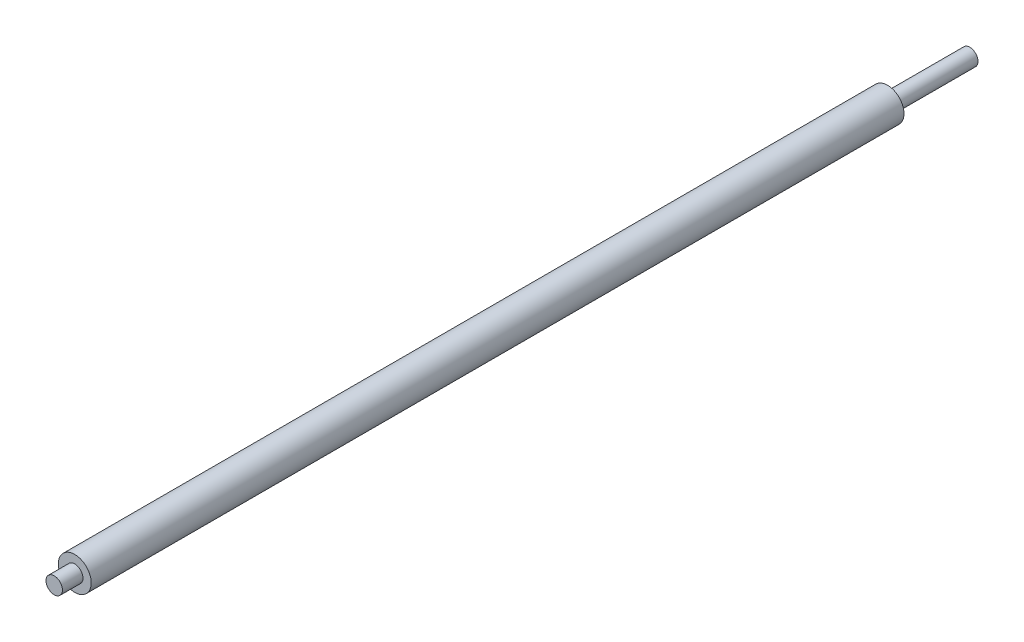
ISO-10303-21;
HEADER;
FILE_DESCRIPTION(('STEP AP214'),'2;1');
FILE_NAME('part.step','',(''),(''),'','','');
FILE_SCHEMA(('AUTOMOTIVE_DESIGN { 1 0 10303 214 1 1 1 1 }'));
ENDSEC;
DATA;
#1=APPLICATION_CONTEXT('core data for automotive mechanical design processes');
#2=APPLICATION_PROTOCOL_DEFINITION('international standard','automotive_design',2000,#1);
#3=PRODUCT_CONTEXT('',#1,'mechanical');
#4=PRODUCT('Part','Part','',(#3));
#5=PRODUCT_RELATED_PRODUCT_CATEGORY('part','',(#4));
#6=PRODUCT_DEFINITION_FORMATION('','',#4);
#7=PRODUCT_DEFINITION_CONTEXT('part definition',#1,'design');
#8=PRODUCT_DEFINITION('design','',#6,#7);
#9=PRODUCT_DEFINITION_SHAPE('','',#8);
#10=(LENGTH_UNIT() NAMED_UNIT(*) SI_UNIT(.MILLI.,.METRE.));
#11=(NAMED_UNIT(*) PLANE_ANGLE_UNIT() SI_UNIT($,.RADIAN.));
#12=(NAMED_UNIT(*) SI_UNIT($,.STERADIAN.) SOLID_ANGLE_UNIT());
#13=UNCERTAINTY_MEASURE_WITH_UNIT(LENGTH_MEASURE(1.E-05),#10,'distance_accuracy_value','');
#14=(GEOMETRIC_REPRESENTATION_CONTEXT(3) GLOBAL_UNCERTAINTY_ASSIGNED_CONTEXT((#13)) GLOBAL_UNIT_ASSIGNED_CONTEXT((#10,
#11,#12)) REPRESENTATION_CONTEXT('',''));
#15=CARTESIAN_POINT('',(0.,0.,0.));
#16=DIRECTION('',(0.,0.,1.));
#17=DIRECTION('',(1.,0.,0.));
#18=AXIS2_PLACEMENT_3D('',#15,#16,#17);
#19=CARTESIAN_POINT('',(0.,0.,-148.25));
#20=DIRECTION('',(0.,0.,1.));
#21=DIRECTION('',(1.,0.,0.));
#22=AXIS2_PLACEMENT_3D('',#19,#20,#21);
#23=PLANE('',#22);
#24=CARTESIAN_POINT('',(0.,0.,-148.25));
#25=DIRECTION('',(0.,0.,1.));
#26=DIRECTION('',(1.,0.,0.));
#27=AXIS2_PLACEMENT_3D('',#24,#25,#26);
#28=CIRCLE('',#27,6.);
#29=CARTESIAN_POINT('',(6.,0.,-148.25));
#30=VERTEX_POINT('',#29);
#31=EDGE_CURVE('E42',#30,#30,#28,.T.);
#32=ORIENTED_EDGE('',*,*,#31,.F.);
#33=EDGE_LOOP('',(#32));
#34=FACE_BOUND('',#33,.T.);
#35=CARTESIAN_POINT('',(0.,0.,-148.25));
#36=DIRECTION('',(0.,0.,1.));
#37=DIRECTION('',(1.,0.,0.));
#38=AXIS2_PLACEMENT_3D('',#35,#36,#37);
#39=CIRCLE('',#38,3.);
#40=CARTESIAN_POINT('',(3.,0.,-148.25));
#41=VERTEX_POINT('',#40);
#42=EDGE_CURVE('E10',#41,#41,#39,.F.);
#43=ORIENTED_EDGE('',*,*,#42,.F.);
#44=EDGE_LOOP('',(#43));
#45=FACE_BOUND('',#44,.T.);
#46=ADVANCED_FACE('F31',(#34,#45),#23,.F.);
#47=CARTESIAN_POINT('',(0.,0.,148.25));
#48=DIRECTION('',(0.,0.,1.));
#49=DIRECTION('',(1.,0.,0.));
#50=AXIS2_PLACEMENT_3D('',#47,#48,#49);
#51=PLANE('',#50);
#52=CARTESIAN_POINT('',(0.,0.,148.25));
#53=DIRECTION('',(0.,0.,1.));
#54=DIRECTION('',(1.,0.,0.));
#55=AXIS2_PLACEMENT_3D('',#52,#53,#54);
#56=CIRCLE('',#55,6.);
#57=CARTESIAN_POINT('',(6.,0.,148.25));
#58=VERTEX_POINT('',#57);
#59=EDGE_CURVE('E38',#58,#58,#56,.T.);
#60=ORIENTED_EDGE('',*,*,#59,.T.);
#61=EDGE_LOOP('',(#60));
#62=FACE_BOUND('',#61,.T.);
#63=CARTESIAN_POINT('',(0.,0.,148.25));
#64=DIRECTION('',(0.,0.,1.));
#65=DIRECTION('',(1.,0.,0.));
#66=AXIS2_PLACEMENT_3D('',#63,#64,#65);
#67=CIRCLE('',#66,3.);
#68=CARTESIAN_POINT('',(3.,0.,148.25));
#69=VERTEX_POINT('',#68);
#70=EDGE_CURVE('E49',#69,#69,#67,.T.);
#71=ORIENTED_EDGE('',*,*,#70,.F.);
#72=EDGE_LOOP('',(#71));
#73=FACE_BOUND('',#72,.T.);
#74=ADVANCED_FACE('F73',(#62,#73),#51,.T.);
#75=CARTESIAN_POINT('',(0.,0.,148.25));
#76=DIRECTION('',(0.,0.,-1.));
#77=DIRECTION('',(-1.,0.,0.));
#78=AXIS2_PLACEMENT_3D('',#75,#76,#77);
#79=CYLINDRICAL_SURFACE('',#78,6.);
#80=ORIENTED_EDGE('',*,*,#59,.F.);
#81=EDGE_LOOP('',(#80));
#82=FACE_BOUND('',#81,.T.);
#83=ORIENTED_EDGE('',*,*,#31,.T.);
#84=EDGE_LOOP('',(#83));
#85=FACE_BOUND('',#84,.T.);
#86=ADVANCED_FACE('F33',(#82,#85),#79,.T.);
#87=CARTESIAN_POINT('',(0.,0.,155.75));
#88=DIRECTION('',(0.,0.,-1.));
#89=DIRECTION('',(-1.,0.,0.));
#90=AXIS2_PLACEMENT_3D('',#87,#88,#89);
#91=CYLINDRICAL_SURFACE('',#90,3.);
#92=CARTESIAN_POINT('',(0.,0.,155.75));
#93=DIRECTION('',(0.,0.,1.));
#94=DIRECTION('',(1.,0.,0.));
#95=AXIS2_PLACEMENT_3D('',#92,#93,#94);
#96=CIRCLE('',#95,3.);
#97=CARTESIAN_POINT('',(3.,0.,155.75));
#98=VERTEX_POINT('',#97);
#99=EDGE_CURVE('E47',#98,#98,#96,.T.);
#100=ORIENTED_EDGE('',*,*,#99,.F.);
#101=EDGE_LOOP('',(#100));
#102=FACE_BOUND('',#101,.T.);
#103=ORIENTED_EDGE('',*,*,#70,.T.);
#104=EDGE_LOOP('',(#103));
#105=FACE_BOUND('',#104,.T.);
#106=ADVANCED_FACE('F69',(#102,#105),#91,.T.);
#107=CARTESIAN_POINT('',(0.,0.,155.75));
#108=DIRECTION('',(0.,0.,1.));
#109=DIRECTION('',(1.,0.,0.));
#110=AXIS2_PLACEMENT_3D('',#107,#108,#109);
#111=PLANE('',#110);
#112=ORIENTED_EDGE('',*,*,#99,.T.);
#113=EDGE_LOOP('',(#112));
#114=FACE_BOUND('',#113,.T.);
#115=ADVANCED_FACE('F62',(#114),#111,.T.);
#116=CARTESIAN_POINT('',(0.,0.,-178.25));
#117=DIRECTION('',(0.,0.,1.));
#118=DIRECTION('',(1.,0.,0.));
#119=AXIS2_PLACEMENT_3D('',#116,#117,#118);
#120=CYLINDRICAL_SURFACE('',#119,3.);
#121=CARTESIAN_POINT('',(0.,0.,-178.25));
#122=DIRECTION('',(0.,0.,-1.));
#123=DIRECTION('',(-1.,0.,0.));
#124=AXIS2_PLACEMENT_3D('',#121,#122,#123);
#125=CIRCLE('',#124,3.);
#126=CARTESIAN_POINT('',(-3.,0.,-178.25));
#127=VERTEX_POINT('',#126);
#128=EDGE_CURVE('E52',#127,#127,#125,.T.);
#129=ORIENTED_EDGE('',*,*,#128,.F.);
#130=EDGE_LOOP('',(#129));
#131=FACE_BOUND('',#130,.T.);
#132=ORIENTED_EDGE('',*,*,#42,.T.);
#133=EDGE_LOOP('',(#132));
#134=FACE_BOUND('',#133,.T.);
#135=ADVANCED_FACE('F60',(#131,#134),#120,.T.);
#136=CARTESIAN_POINT('',(0.,0.,-178.25));
#137=DIRECTION('',(0.,0.,-1.));
#138=DIRECTION('',(-1.,0.,0.));
#139=AXIS2_PLACEMENT_3D('',#136,#137,#138);
#140=PLANE('',#139);
#141=ORIENTED_EDGE('',*,*,#128,.T.);
#142=EDGE_LOOP('',(#141));
#143=FACE_BOUND('',#142,.T.);
#144=ADVANCED_FACE('F58',(#143),#140,.T.);
#145=CLOSED_SHELL('',(#46,#74,#86,#106,#115,#135,#144));
#146=MANIFOLD_SOLID_BREP('B2',#145);
#147=ADVANCED_BREP_SHAPE_REPRESENTATION('',(#18,#146),#14);
#148=SHAPE_DEFINITION_REPRESENTATION(#9,#147);
ENDSEC;
END-ISO-10303-21;
